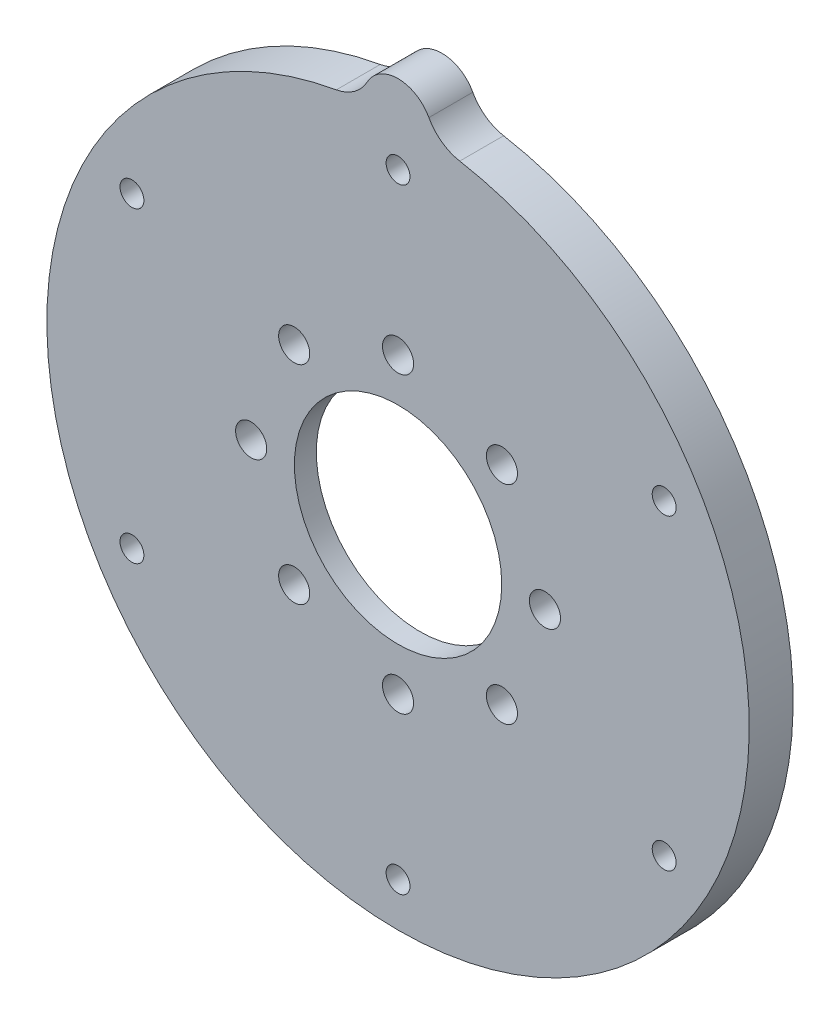
ISO-10303-21;
HEADER;
FILE_DESCRIPTION(('STEP AP214'),'2;1');
FILE_NAME('part.step','',(''),(''),'','','');
FILE_SCHEMA(('AUTOMOTIVE_DESIGN { 1 0 10303 214 1 1 1 1 }'));
ENDSEC;
DATA;
#1=APPLICATION_CONTEXT('core data for automotive mechanical design processes');
#2=APPLICATION_PROTOCOL_DEFINITION('international standard','automotive_design',2000,#1);
#3=PRODUCT_CONTEXT('',#1,'mechanical');
#4=PRODUCT('Part','Part','',(#3));
#5=PRODUCT_RELATED_PRODUCT_CATEGORY('part','',(#4));
#6=PRODUCT_DEFINITION_FORMATION('','',#4);
#7=PRODUCT_DEFINITION_CONTEXT('part definition',#1,'design');
#8=PRODUCT_DEFINITION('design','',#6,#7);
#9=PRODUCT_DEFINITION_SHAPE('','',#8);
#10=(LENGTH_UNIT() NAMED_UNIT(*) SI_UNIT(.MILLI.,.METRE.));
#11=(NAMED_UNIT(*) PLANE_ANGLE_UNIT() SI_UNIT($,.RADIAN.));
#12=(NAMED_UNIT(*) SI_UNIT($,.STERADIAN.) SOLID_ANGLE_UNIT());
#13=UNCERTAINTY_MEASURE_WITH_UNIT(LENGTH_MEASURE(1.E-05),#10,'distance_accuracy_value','');
#14=(GEOMETRIC_REPRESENTATION_CONTEXT(3) GLOBAL_UNCERTAINTY_ASSIGNED_CONTEXT((#13)) GLOBAL_UNIT_ASSIGNED_CONTEXT((#10,
#11,#12)) REPRESENTATION_CONTEXT('',''));
#15=CARTESIAN_POINT('',(0.,0.,0.));
#16=DIRECTION('',(0.,0.,1.));
#17=DIRECTION('',(1.,0.,0.));
#18=AXIS2_PLACEMENT_3D('',#15,#16,#17);
#19=CARTESIAN_POINT('',(0.,0.,6.35));
#20=DIRECTION('',(0.,0.,1.));
#21=DIRECTION('',(1.,0.,0.));
#22=AXIS2_PLACEMENT_3D('',#19,#20,#21);
#23=PLANE('',#22);
#24=CARTESIAN_POINT('',(-38.494829198218,22.2250000000004,6.35));
#25=DIRECTION('',(0.,0.,1.));
#26=DIRECTION('',(1.,0.,0.));
#27=AXIS2_PLACEMENT_3D('',#24,#25,#26);
#28=CIRCLE('',#27,1.72719999999998);
#29=CARTESIAN_POINT('',(-36.767629198218,22.2250000000004,6.35));
#30=VERTEX_POINT('',#29);
#31=EDGE_CURVE('E109',#30,#30,#28,.T.);
#32=ORIENTED_EDGE('',*,*,#31,.F.);
#33=EDGE_LOOP('',(#32));
#34=FACE_BOUND('',#33,.T.);
#35=CARTESIAN_POINT('',(-38.4948291982185,-22.2249999999996,6.35));
#36=DIRECTION('',(0.,0.,1.));
#37=DIRECTION('',(1.,0.,0.));
#38=AXIS2_PLACEMENT_3D('',#35,#36,#37);
#39=CIRCLE('',#38,1.72719999999999);
#40=CARTESIAN_POINT('',(-36.7676291982185,-22.2249999999996,6.35));
#41=VERTEX_POINT('',#40);
#42=EDGE_CURVE('E117',#41,#41,#39,.T.);
#43=ORIENTED_EDGE('',*,*,#42,.F.);
#44=EDGE_LOOP('',(#43));
#45=FACE_BOUND('',#44,.T.);
#46=CARTESIAN_POINT('',(0.,-44.45,6.35));
#47=DIRECTION('',(0.,0.,1.));
#48=DIRECTION('',(1.,0.,0.));
#49=AXIS2_PLACEMENT_3D('',#46,#47,#48);
#50=CIRCLE('',#49,1.72719999999999);
#51=CARTESIAN_POINT('',(1.72719999999999,-44.45,6.35));
#52=VERTEX_POINT('',#51);
#53=EDGE_CURVE('E123',#52,#52,#50,.T.);
#54=ORIENTED_EDGE('',*,*,#53,.F.);
#55=EDGE_LOOP('',(#54));
#56=FACE_BOUND('',#55,.T.);
#57=CARTESIAN_POINT('',(38.4948291982182,-22.2250000000002,6.35));
#58=DIRECTION('',(0.,0.,1.));
#59=DIRECTION('',(1.,0.,0.));
#60=AXIS2_PLACEMENT_3D('',#57,#58,#59);
#61=CIRCLE('',#60,1.72719999999998);
#62=CARTESIAN_POINT('',(40.2220291982182,-22.2250000000002,6.35));
#63=VERTEX_POINT('',#62);
#64=EDGE_CURVE('E129',#63,#63,#61,.T.);
#65=ORIENTED_EDGE('',*,*,#64,.F.);
#66=EDGE_LOOP('',(#65));
#67=FACE_BOUND('',#66,.T.);
#68=CARTESIAN_POINT('',(38.4948291982183,22.2249999999999,6.35));
#69=DIRECTION('',(0.,0.,1.));
#70=DIRECTION('',(1.,0.,0.));
#71=AXIS2_PLACEMENT_3D('',#68,#69,#70);
#72=CIRCLE('',#71,1.72719999999999);
#73=CARTESIAN_POINT('',(40.2220291982183,22.2249999999999,6.35));
#74=VERTEX_POINT('',#73);
#75=EDGE_CURVE('E135',#74,#74,#72,.T.);
#76=ORIENTED_EDGE('',*,*,#75,.F.);
#77=EDGE_LOOP('',(#76));
#78=FACE_BOUND('',#77,.T.);
#79=CARTESIAN_POINT('',(0.,44.45,6.35));
#80=DIRECTION('',(0.,0.,1.));
#81=DIRECTION('',(1.,0.,0.));
#82=AXIS2_PLACEMENT_3D('',#79,#80,#81);
#83=CIRCLE('',#82,1.72719999999999);
#84=CARTESIAN_POINT('',(1.72719999999999,44.45,6.35));
#85=VERTEX_POINT('',#84);
#86=EDGE_CURVE('E141',#85,#85,#83,.T.);
#87=ORIENTED_EDGE('',*,*,#86,.F.);
#88=EDGE_LOOP('',(#87));
#89=FACE_BOUND('',#88,.T.);
#90=CARTESIAN_POINT('',(-15.0260190422312,15.0260190422316,6.35));
#91=DIRECTION('',(0.,0.,1.));
#92=DIRECTION('',(1.,0.,0.));
#93=AXIS2_PLACEMENT_3D('',#90,#91,#92);
#94=CIRCLE('',#93,2.25);
#95=CARTESIAN_POINT('',(-12.7760190422312,15.0260190422316,6.35));
#96=VERTEX_POINT('',#95);
#97=EDGE_CURVE('E175',#96,#96,#94,.T.);
#98=ORIENTED_EDGE('',*,*,#97,.F.);
#99=EDGE_LOOP('',(#98));
#100=FACE_BOUND('',#99,.T.);
#101=CARTESIAN_POINT('',(-21.249999918,2.22582063411818E-13,6.35));
#102=DIRECTION('',(0.,0.,1.));
#103=DIRECTION('',(1.,0.,0.));
#104=AXIS2_PLACEMENT_3D('',#101,#102,#103);
#105=CIRCLE('',#104,2.25);
#106=CARTESIAN_POINT('',(-18.999999918,2.22582063411818E-13,6.35));
#107=VERTEX_POINT('',#106);
#108=EDGE_CURVE('E178',#107,#107,#105,.T.);
#109=ORIENTED_EDGE('',*,*,#108,.F.);
#110=EDGE_LOOP('',(#109));
#111=FACE_BOUND('',#110,.T.);
#112=CARTESIAN_POINT('',(-15.0260190422315,-15.0260190422312,6.35));
#113=DIRECTION('',(0.,0.,1.));
#114=DIRECTION('',(1.,0.,0.));
#115=AXIS2_PLACEMENT_3D('',#112,#113,#114);
#116=CIRCLE('',#115,2.25);
#117=CARTESIAN_POINT('',(-12.7760190422315,-15.0260190422312,6.35));
#118=VERTEX_POINT('',#117);
#119=EDGE_CURVE('E181',#118,#118,#116,.T.);
#120=ORIENTED_EDGE('',*,*,#119,.F.);
#121=EDGE_LOOP('',(#120));
#122=FACE_BOUND('',#121,.T.);
#123=CARTESIAN_POINT('',(0.,-21.249999918,6.35));
#124=DIRECTION('',(0.,0.,1.));
#125=DIRECTION('',(1.,0.,0.));
#126=AXIS2_PLACEMENT_3D('',#123,#124,#125);
#127=CIRCLE('',#126,2.25);
#128=CARTESIAN_POINT('',(2.25,-21.249999918,6.35));
#129=VERTEX_POINT('',#128);
#130=EDGE_CURVE('E184',#129,#129,#127,.T.);
#131=ORIENTED_EDGE('',*,*,#130,.F.);
#132=EDGE_LOOP('',(#131));
#133=FACE_BOUND('',#132,.T.);
#134=CARTESIAN_POINT('',(15.0260190422313,-15.0260190422315,6.35));
#135=DIRECTION('',(0.,0.,1.));
#136=DIRECTION('',(1.,0.,0.));
#137=AXIS2_PLACEMENT_3D('',#134,#135,#136);
#138=CIRCLE('',#137,2.25);
#139=CARTESIAN_POINT('',(17.2760190422313,-15.0260190422315,6.35));
#140=VERTEX_POINT('',#139);
#141=EDGE_CURVE('E187',#140,#140,#138,.T.);
#142=ORIENTED_EDGE('',*,*,#141,.F.);
#143=EDGE_LOOP('',(#142));
#144=FACE_BOUND('',#143,.T.);
#145=CARTESIAN_POINT('',(21.249999918,0.,6.35));
#146=DIRECTION('',(0.,0.,1.));
#147=DIRECTION('',(1.,0.,0.));
#148=AXIS2_PLACEMENT_3D('',#145,#146,#147);
#149=CIRCLE('',#148,2.25);
#150=CARTESIAN_POINT('',(23.499999918,0.,6.35));
#151=VERTEX_POINT('',#150);
#152=EDGE_CURVE('E190',#151,#151,#149,.T.);
#153=ORIENTED_EDGE('',*,*,#152,.F.);
#154=EDGE_LOOP('',(#153));
#155=FACE_BOUND('',#154,.T.);
#156=CARTESIAN_POINT('',(15.0260190422314,15.0260190422314,6.35));
#157=DIRECTION('',(0.,0.,1.));
#158=DIRECTION('',(1.,0.,0.));
#159=AXIS2_PLACEMENT_3D('',#156,#157,#158);
#160=CIRCLE('',#159,2.25);
#161=CARTESIAN_POINT('',(17.2760190422314,15.0260190422314,6.35));
#162=VERTEX_POINT('',#161);
#163=EDGE_CURVE('E193',#162,#162,#160,.T.);
#164=ORIENTED_EDGE('',*,*,#163,.F.);
#165=EDGE_LOOP('',(#164));
#166=FACE_BOUND('',#165,.T.);
#167=CARTESIAN_POINT('',(0.,21.249999918,6.35));
#168=DIRECTION('',(0.,0.,1.));
#169=DIRECTION('',(1.,0.,0.));
#170=AXIS2_PLACEMENT_3D('',#167,#168,#169);
#171=CIRCLE('',#170,2.25);
#172=CARTESIAN_POINT('',(2.25,21.249999918,6.35));
#173=VERTEX_POINT('',#172);
#174=EDGE_CURVE('E196',#173,#173,#171,.T.);
#175=ORIENTED_EDGE('',*,*,#174,.F.);
#176=EDGE_LOOP('',(#175));
#177=FACE_BOUND('',#176,.T.);
#178=CARTESIAN_POINT('',(0.,50.8,6.35));
#179=DIRECTION('',(0.,0.,1.));
#180=DIRECTION('',(1.,0.,0.));
#181=AXIS2_PLACEMENT_3D('',#178,#179,#180);
#182=CIRCLE('',#181,5.08000000000005);
#183=CARTESIAN_POINT('',(4.46268211441522,53.2271111111111,6.35));
#184=VERTEX_POINT('',#183);
#185=CARTESIAN_POINT('',(-4.46268211441522,53.2271111111111,6.35));
#186=VERTEX_POINT('',#185);
#187=EDGE_CURVE('E105',#184,#186,#182,.T.);
#188=ORIENTED_EDGE('',*,*,#187,.T.);
#189=CARTESIAN_POINT('',(-10.0410347574342,56.261,6.35));
#190=DIRECTION('',(0.,0.,1.));
#191=DIRECTION('',(1.,0.,0.));
#192=AXIS2_PLACEMENT_3D('',#189,#190,#191);
#193=CIRCLE('',#192,6.35);
#194=CARTESIAN_POINT('',(-8.92536422883038,50.0097777777778,6.35));
#195=VERTEX_POINT('',#194);
#196=EDGE_CURVE('E44',#186,#195,#193,.F.);
#197=ORIENTED_EDGE('',*,*,#196,.T.);
#198=CARTESIAN_POINT('',(0.,0.,6.35));
#199=DIRECTION('',(0.,0.,1.));
#200=DIRECTION('',(1.,0.,0.));
#201=AXIS2_PLACEMENT_3D('',#198,#199,#200);
#202=CIRCLE('',#201,50.8);
#203=CARTESIAN_POINT('',(8.92536422883039,50.0097777777778,6.35));
#204=VERTEX_POINT('',#203);
#205=EDGE_CURVE('E83',#195,#204,#202,.T.);
#206=ORIENTED_EDGE('',*,*,#205,.T.);
#207=CARTESIAN_POINT('',(10.0410347574342,56.261,6.35));
#208=DIRECTION('',(0.,0.,1.));
#209=DIRECTION('',(1.,0.,0.));
#210=AXIS2_PLACEMENT_3D('',#207,#208,#209);
#211=CIRCLE('',#210,6.35);
#212=EDGE_CURVE('E58',#204,#184,#211,.F.);
#213=ORIENTED_EDGE('',*,*,#212,.T.);
#214=EDGE_LOOP('',(#188,#197,#206,#213));
#215=FACE_BOUND('',#214,.T.);
#216=CARTESIAN_POINT('',(0.,0.,6.35));
#217=DIRECTION('',(0.,0.,1.));
#218=DIRECTION('',(1.,0.,0.));
#219=AXIS2_PLACEMENT_3D('',#216,#217,#218);
#220=CIRCLE('',#219,15.);
#221=CARTESIAN_POINT('',(15.,0.,6.35));
#222=VERTEX_POINT('',#221);
#223=EDGE_CURVE('E94',#222,#222,#220,.T.);
#224=ORIENTED_EDGE('',*,*,#223,.F.);
#225=EDGE_LOOP('',(#224));
#226=FACE_BOUND('',#225,.T.);
#227=ADVANCED_FACE('F36',(#34,#45,#56,#67,#78,#89,#100,#111,#122,#133,#144,#155,#166,#177,#215,
#226),#23,.T.);
#228=CARTESIAN_POINT('',(0.,0.,0.));
#229=DIRECTION('',(0.,0.,1.));
#230=DIRECTION('',(1.,0.,0.));
#231=AXIS2_PLACEMENT_3D('',#228,#229,#230);
#232=PLANE('',#231);
#233=CARTESIAN_POINT('',(-38.494829198218,22.2250000000004,0.));
#234=DIRECTION('',(0.,0.,1.));
#235=DIRECTION('',(1.,0.,0.));
#236=AXIS2_PLACEMENT_3D('',#233,#234,#235);
#237=CIRCLE('',#236,1.72719999999998);
#238=CARTESIAN_POINT('',(-36.767629198218,22.2250000000004,0.));
#239=VERTEX_POINT('',#238);
#240=EDGE_CURVE('E114',#239,#239,#237,.T.);
#241=ORIENTED_EDGE('',*,*,#240,.T.);
#242=EDGE_LOOP('',(#241));
#243=FACE_BOUND('',#242,.T.);
#244=CARTESIAN_POINT('',(-38.4948291982185,-22.2249999999996,0.));
#245=DIRECTION('',(0.,0.,1.));
#246=DIRECTION('',(1.,0.,0.));
#247=AXIS2_PLACEMENT_3D('',#244,#245,#246);
#248=CIRCLE('',#247,1.72719999999998);
#249=CARTESIAN_POINT('',(-36.7676291982185,-22.2249999999996,0.));
#250=VERTEX_POINT('',#249);
#251=EDGE_CURVE('E120',#250,#250,#248,.T.);
#252=ORIENTED_EDGE('',*,*,#251,.T.);
#253=EDGE_LOOP('',(#252));
#254=FACE_BOUND('',#253,.T.);
#255=CARTESIAN_POINT('',(0.,-44.45,0.));
#256=DIRECTION('',(0.,0.,1.));
#257=DIRECTION('',(1.,0.,0.));
#258=AXIS2_PLACEMENT_3D('',#255,#256,#257);
#259=CIRCLE('',#258,1.72719999999999);
#260=CARTESIAN_POINT('',(1.72719999999999,-44.45,0.));
#261=VERTEX_POINT('',#260);
#262=EDGE_CURVE('E126',#261,#261,#259,.T.);
#263=ORIENTED_EDGE('',*,*,#262,.T.);
#264=EDGE_LOOP('',(#263));
#265=FACE_BOUND('',#264,.T.);
#266=CARTESIAN_POINT('',(38.4948291982182,-22.2250000000002,0.));
#267=DIRECTION('',(0.,0.,1.));
#268=DIRECTION('',(1.,0.,0.));
#269=AXIS2_PLACEMENT_3D('',#266,#267,#268);
#270=CIRCLE('',#269,1.72719999999998);
#271=CARTESIAN_POINT('',(40.2220291982182,-22.2250000000002,0.));
#272=VERTEX_POINT('',#271);
#273=EDGE_CURVE('E132',#272,#272,#270,.T.);
#274=ORIENTED_EDGE('',*,*,#273,.T.);
#275=EDGE_LOOP('',(#274));
#276=FACE_BOUND('',#275,.T.);
#277=CARTESIAN_POINT('',(38.4948291982183,22.2249999999999,0.));
#278=DIRECTION('',(0.,0.,1.));
#279=DIRECTION('',(1.,0.,0.));
#280=AXIS2_PLACEMENT_3D('',#277,#278,#279);
#281=CIRCLE('',#280,1.72719999999998);
#282=CARTESIAN_POINT('',(40.2220291982183,22.2249999999999,0.));
#283=VERTEX_POINT('',#282);
#284=EDGE_CURVE('E138',#283,#283,#281,.T.);
#285=ORIENTED_EDGE('',*,*,#284,.T.);
#286=EDGE_LOOP('',(#285));
#287=FACE_BOUND('',#286,.T.);
#288=CARTESIAN_POINT('',(0.,44.45,0.));
#289=DIRECTION('',(0.,0.,1.));
#290=DIRECTION('',(1.,0.,0.));
#291=AXIS2_PLACEMENT_3D('',#288,#289,#290);
#292=CIRCLE('',#291,1.72719999999999);
#293=CARTESIAN_POINT('',(1.72719999999999,44.45,0.));
#294=VERTEX_POINT('',#293);
#295=EDGE_CURVE('E144',#294,#294,#292,.T.);
#296=ORIENTED_EDGE('',*,*,#295,.T.);
#297=EDGE_LOOP('',(#296));
#298=FACE_BOUND('',#297,.T.);
#299=CARTESIAN_POINT('',(0.,0.,0.));
#300=DIRECTION('',(0.,0.,1.));
#301=DIRECTION('',(1.,0.,0.));
#302=AXIS2_PLACEMENT_3D('',#299,#300,#301);
#303=CIRCLE('',#302,42.0374);
#304=CARTESIAN_POINT('',(42.0374,0.,0.));
#305=VERTEX_POINT('',#304);
#306=EDGE_CURVE('E86',#305,#305,#303,.T.);
#307=ORIENTED_EDGE('',*,*,#306,.T.);
#308=EDGE_LOOP('',(#307));
#309=FACE_BOUND('',#308,.T.);
#310=CARTESIAN_POINT('',(0.,0.,0.));
#311=DIRECTION('',(0.,0.,1.));
#312=DIRECTION('',(1.,0.,0.));
#313=AXIS2_PLACEMENT_3D('',#310,#311,#312);
#314=CIRCLE('',#313,50.8);
#315=CARTESIAN_POINT('',(-8.92536422883038,50.0097777777778,0.));
#316=VERTEX_POINT('',#315);
#317=CARTESIAN_POINT('',(8.92536422883039,50.0097777777778,0.));
#318=VERTEX_POINT('',#317);
#319=EDGE_CURVE('E81',#316,#318,#314,.T.);
#320=ORIENTED_EDGE('',*,*,#319,.F.);
#321=CARTESIAN_POINT('',(-10.0410347574342,56.261,0.));
#322=DIRECTION('',(0.,0.,1.));
#323=DIRECTION('',(1.,0.,0.));
#324=AXIS2_PLACEMENT_3D('',#321,#322,#323);
#325=CIRCLE('',#324,6.35);
#326=CARTESIAN_POINT('',(-4.46268211441522,53.2271111111111,0.));
#327=VERTEX_POINT('',#326);
#328=EDGE_CURVE('E12',#316,#327,#325,.T.);
#329=ORIENTED_EDGE('',*,*,#328,.T.);
#330=CARTESIAN_POINT('',(0.,50.8,0.));
#331=DIRECTION('',(0.,0.,1.));
#332=DIRECTION('',(1.,0.,0.));
#333=AXIS2_PLACEMENT_3D('',#330,#331,#332);
#334=CIRCLE('',#333,5.08000000000005);
#335=CARTESIAN_POINT('',(4.46268211441522,53.2271111111111,0.));
#336=VERTEX_POINT('',#335);
#337=EDGE_CURVE('E107',#327,#336,#334,.F.);
#338=ORIENTED_EDGE('',*,*,#337,.T.);
#339=CARTESIAN_POINT('',(10.0410347574342,56.261,0.));
#340=DIRECTION('',(0.,0.,1.));
#341=DIRECTION('',(1.,0.,0.));
#342=AXIS2_PLACEMENT_3D('',#339,#340,#341);
#343=CIRCLE('',#342,6.35);
#344=EDGE_CURVE('E93',#336,#318,#343,.T.);
#345=ORIENTED_EDGE('',*,*,#344,.T.);
#346=EDGE_LOOP('',(#320,#329,#338,#345));
#347=FACE_BOUND('',#346,.T.);
#348=ADVANCED_FACE('F89',(#243,#254,#265,#276,#287,#298,#309,#347),#232,.F.);
#349=CARTESIAN_POINT('',(0.,0.,6.35));
#350=DIRECTION('',(0.,0.,-1.));
#351=DIRECTION('',(-1.,0.,0.));
#352=AXIS2_PLACEMENT_3D('',#349,#350,#351);
#353=CYLINDRICAL_SURFACE('',#352,50.8);
#354=ORIENTED_EDGE('',*,*,#319,.T.);
#355=DIRECTION('',(0.,0.,-1.));
#356=VECTOR('',#355,1.);
#357=CARTESIAN_POINT('',(8.92536422883039,50.0097777777778,6.35));
#358=LINE('',#357,#356);
#359=EDGE_CURVE('E85',#318,#204,#358,.F.);
#360=ORIENTED_EDGE('',*,*,#359,.T.);
#361=ORIENTED_EDGE('',*,*,#205,.F.);
#362=DIRECTION('',(0.,0.,-1.));
#363=VECTOR('',#362,1.);
#364=CARTESIAN_POINT('',(-8.92536422883038,50.0097777777778,6.35));
#365=LINE('',#364,#363);
#366=EDGE_CURVE('E77',#195,#316,#365,.T.);
#367=ORIENTED_EDGE('',*,*,#366,.T.);
#368=EDGE_LOOP('',(#354,#360,#361,#367));
#369=FACE_BOUND('',#368,.T.);
#370=ADVANCED_FACE('F79',(#369),#353,.T.);
#371=CARTESIAN_POINT('',(0.,0.,6.35));
#372=DIRECTION('',(0.,0.,-1.));
#373=DIRECTION('',(-1.,0.,0.));
#374=AXIS2_PLACEMENT_3D('',#371,#372,#373);
#375=CYLINDRICAL_SURFACE('',#374,15.);
#376=CARTESIAN_POINT('',(0.,0.,3.175));
#377=DIRECTION('',(0.,0.,1.));
#378=DIRECTION('',(1.,0.,0.));
#379=AXIS2_PLACEMENT_3D('',#376,#377,#378);
#380=CIRCLE('',#379,15.);
#381=CARTESIAN_POINT('',(15.,0.,3.175));
#382=VERTEX_POINT('',#381);
#383=EDGE_CURVE('E172',#382,#382,#380,.T.);
#384=ORIENTED_EDGE('',*,*,#383,.F.);
#385=EDGE_LOOP('',(#384));
#386=FACE_BOUND('',#385,.T.);
#387=ORIENTED_EDGE('',*,*,#223,.T.);
#388=EDGE_LOOP('',(#387));
#389=FACE_BOUND('',#388,.T.);
#390=ADVANCED_FACE('F242',(#386,#389),#375,.F.);
#391=CARTESIAN_POINT('',(0.,21.249999918,6.35));
#392=DIRECTION('',(0.,0.,1.));
#393=DIRECTION('',(1.,0.,0.));
#394=AXIS2_PLACEMENT_3D('',#391,#392,#393);
#395=CYLINDRICAL_SURFACE('',#394,2.25);
#396=CARTESIAN_POINT('',(0.,21.249999918,3.175));
#397=DIRECTION('',(0.,0.,1.));
#398=DIRECTION('',(1.,0.,0.));
#399=AXIS2_PLACEMENT_3D('',#396,#397,#398);
#400=CIRCLE('',#399,2.25);
#401=CARTESIAN_POINT('',(2.25,21.249999918,3.175));
#402=VERTEX_POINT('',#401);
#403=EDGE_CURVE('E169',#402,#402,#400,.F.);
#404=ORIENTED_EDGE('',*,*,#403,.T.);
#405=EDGE_LOOP('',(#404));
#406=FACE_BOUND('',#405,.T.);
#407=ORIENTED_EDGE('',*,*,#174,.T.);
#408=EDGE_LOOP('',(#407));
#409=FACE_BOUND('',#408,.T.);
#410=ADVANCED_FACE('F238',(#406,#409),#395,.F.);
#411=CARTESIAN_POINT('',(15.0260190422314,15.0260190422314,6.35));
#412=DIRECTION('',(0.,0.,1.));
#413=DIRECTION('',(1.,0.,0.));
#414=AXIS2_PLACEMENT_3D('',#411,#412,#413);
#415=CYLINDRICAL_SURFACE('',#414,2.25);
#416=CARTESIAN_POINT('',(15.0260190422314,15.0260190422314,3.175));
#417=DIRECTION('',(0.,0.,1.));
#418=DIRECTION('',(1.,0.,0.));
#419=AXIS2_PLACEMENT_3D('',#416,#417,#418);
#420=CIRCLE('',#419,2.25);
#421=CARTESIAN_POINT('',(17.2760190422314,15.0260190422314,3.175));
#422=VERTEX_POINT('',#421);
#423=EDGE_CURVE('E166',#422,#422,#420,.F.);
#424=ORIENTED_EDGE('',*,*,#423,.T.);
#425=EDGE_LOOP('',(#424));
#426=FACE_BOUND('',#425,.T.);
#427=ORIENTED_EDGE('',*,*,#163,.T.);
#428=EDGE_LOOP('',(#427));
#429=FACE_BOUND('',#428,.T.);
#430=ADVANCED_FACE('F241',(#426,#429),#415,.F.);
#431=CARTESIAN_POINT('',(21.249999918,0.,6.35));
#432=DIRECTION('',(0.,0.,1.));
#433=DIRECTION('',(1.,0.,0.));
#434=AXIS2_PLACEMENT_3D('',#431,#432,#433);
#435=CYLINDRICAL_SURFACE('',#434,2.25);
#436=CARTESIAN_POINT('',(21.249999918,0.,3.175));
#437=DIRECTION('',(0.,0.,1.));
#438=DIRECTION('',(1.,0.,0.));
#439=AXIS2_PLACEMENT_3D('',#436,#437,#438);
#440=CIRCLE('',#439,2.25);
#441=CARTESIAN_POINT('',(23.499999918,0.,3.175));
#442=VERTEX_POINT('',#441);
#443=EDGE_CURVE('E163',#442,#442,#440,.F.);
#444=ORIENTED_EDGE('',*,*,#443,.T.);
#445=EDGE_LOOP('',(#444));
#446=FACE_BOUND('',#445,.T.);
#447=ORIENTED_EDGE('',*,*,#152,.T.);
#448=EDGE_LOOP('',(#447));
#449=FACE_BOUND('',#448,.T.);
#450=ADVANCED_FACE('F312',(#446,#449),#435,.F.);
#451=CARTESIAN_POINT('',(15.0260190422313,-15.0260190422315,6.35));
#452=DIRECTION('',(0.,0.,1.));
#453=DIRECTION('',(1.,0.,0.));
#454=AXIS2_PLACEMENT_3D('',#451,#452,#453);
#455=CYLINDRICAL_SURFACE('',#454,2.25);
#456=CARTESIAN_POINT('',(15.0260190422313,-15.0260190422315,3.175));
#457=DIRECTION('',(0.,0.,1.));
#458=DIRECTION('',(1.,0.,0.));
#459=AXIS2_PLACEMENT_3D('',#456,#457,#458);
#460=CIRCLE('',#459,2.25);
#461=CARTESIAN_POINT('',(17.2760190422313,-15.0260190422315,3.175));
#462=VERTEX_POINT('',#461);
#463=EDGE_CURVE('E160',#462,#462,#460,.F.);
#464=ORIENTED_EDGE('',*,*,#463,.T.);
#465=EDGE_LOOP('',(#464));
#466=FACE_BOUND('',#465,.T.);
#467=ORIENTED_EDGE('',*,*,#141,.T.);
#468=EDGE_LOOP('',(#467));
#469=FACE_BOUND('',#468,.T.);
#470=ADVANCED_FACE('F308',(#466,#469),#455,.F.);
#471=CARTESIAN_POINT('',(0.,-21.249999918,6.35));
#472=DIRECTION('',(0.,0.,1.));
#473=DIRECTION('',(1.,0.,0.));
#474=AXIS2_PLACEMENT_3D('',#471,#472,#473);
#475=CYLINDRICAL_SURFACE('',#474,2.25);
#476=CARTESIAN_POINT('',(0.,-21.249999918,3.175));
#477=DIRECTION('',(0.,0.,1.));
#478=DIRECTION('',(1.,0.,0.));
#479=AXIS2_PLACEMENT_3D('',#476,#477,#478);
#480=CIRCLE('',#479,2.25);
#481=CARTESIAN_POINT('',(2.25,-21.249999918,3.175));
#482=VERTEX_POINT('',#481);
#483=EDGE_CURVE('E157',#482,#482,#480,.F.);
#484=ORIENTED_EDGE('',*,*,#483,.T.);
#485=EDGE_LOOP('',(#484));
#486=FACE_BOUND('',#485,.T.);
#487=ORIENTED_EDGE('',*,*,#130,.T.);
#488=EDGE_LOOP('',(#487));
#489=FACE_BOUND('',#488,.T.);
#490=ADVANCED_FACE('F304',(#486,#489),#475,.F.);
#491=CARTESIAN_POINT('',(-15.0260190422315,-15.0260190422312,6.35));
#492=DIRECTION('',(0.,0.,1.));
#493=DIRECTION('',(1.,0.,0.));
#494=AXIS2_PLACEMENT_3D('',#491,#492,#493);
#495=CYLINDRICAL_SURFACE('',#494,2.25);
#496=CARTESIAN_POINT('',(-15.0260190422315,-15.0260190422312,3.175));
#497=DIRECTION('',(0.,0.,1.));
#498=DIRECTION('',(1.,0.,0.));
#499=AXIS2_PLACEMENT_3D('',#496,#497,#498);
#500=CIRCLE('',#499,2.25);
#501=CARTESIAN_POINT('',(-12.7760190422315,-15.0260190422312,3.175));
#502=VERTEX_POINT('',#501);
#503=EDGE_CURVE('E154',#502,#502,#500,.F.);
#504=ORIENTED_EDGE('',*,*,#503,.T.);
#505=EDGE_LOOP('',(#504));
#506=FACE_BOUND('',#505,.T.);
#507=ORIENTED_EDGE('',*,*,#119,.T.);
#508=EDGE_LOOP('',(#507));
#509=FACE_BOUND('',#508,.T.);
#510=ADVANCED_FACE('F300',(#506,#509),#495,.F.);
#511=CARTESIAN_POINT('',(-21.249999918,2.22582063411818E-13,6.35));
#512=DIRECTION('',(0.,0.,1.));
#513=DIRECTION('',(1.,0.,0.));
#514=AXIS2_PLACEMENT_3D('',#511,#512,#513);
#515=CYLINDRICAL_SURFACE('',#514,2.25);
#516=CARTESIAN_POINT('',(-21.249999918,2.22582063411818E-13,3.175));
#517=DIRECTION('',(0.,0.,1.));
#518=DIRECTION('',(1.,0.,0.));
#519=AXIS2_PLACEMENT_3D('',#516,#517,#518);
#520=CIRCLE('',#519,2.25);
#521=CARTESIAN_POINT('',(-18.999999918,2.22582063411818E-13,3.175));
#522=VERTEX_POINT('',#521);
#523=EDGE_CURVE('E151',#522,#522,#520,.F.);
#524=ORIENTED_EDGE('',*,*,#523,.T.);
#525=EDGE_LOOP('',(#524));
#526=FACE_BOUND('',#525,.T.);
#527=ORIENTED_EDGE('',*,*,#108,.T.);
#528=EDGE_LOOP('',(#527));
#529=FACE_BOUND('',#528,.T.);
#530=ADVANCED_FACE('F296',(#526,#529),#515,.F.);
#531=CARTESIAN_POINT('',(-15.0260190422312,15.0260190422316,6.35));
#532=DIRECTION('',(0.,0.,1.));
#533=DIRECTION('',(1.,0.,0.));
#534=AXIS2_PLACEMENT_3D('',#531,#532,#533);
#535=CYLINDRICAL_SURFACE('',#534,2.25);
#536=CARTESIAN_POINT('',(-15.0260190422312,15.0260190422316,3.175));
#537=DIRECTION('',(0.,0.,1.));
#538=DIRECTION('',(1.,0.,0.));
#539=AXIS2_PLACEMENT_3D('',#536,#537,#538);
#540=CIRCLE('',#539,2.25);
#541=CARTESIAN_POINT('',(-12.7760190422312,15.0260190422316,3.175));
#542=VERTEX_POINT('',#541);
#543=EDGE_CURVE('E150',#542,#542,#540,.F.);
#544=ORIENTED_EDGE('',*,*,#543,.T.);
#545=EDGE_LOOP('',(#544));
#546=FACE_BOUND('',#545,.T.);
#547=ORIENTED_EDGE('',*,*,#97,.T.);
#548=EDGE_LOOP('',(#547));
#549=FACE_BOUND('',#548,.T.);
#550=ADVANCED_FACE('F227',(#546,#549),#535,.F.);
#551=CARTESIAN_POINT('',(0.,0.,3.175));
#552=DIRECTION('',(0.,0.,1.));
#553=DIRECTION('',(1.,0.,0.));
#554=AXIS2_PLACEMENT_3D('',#551,#552,#553);
#555=PLANE('',#554);
#556=ORIENTED_EDGE('',*,*,#383,.T.);
#557=EDGE_LOOP('',(#556));
#558=FACE_BOUND('',#557,.T.);
#559=ORIENTED_EDGE('',*,*,#423,.F.);
#560=EDGE_LOOP('',(#559));
#561=FACE_BOUND('',#560,.T.);
#562=ORIENTED_EDGE('',*,*,#463,.F.);
#563=EDGE_LOOP('',(#562));
#564=FACE_BOUND('',#563,.T.);
#565=ORIENTED_EDGE('',*,*,#503,.F.);
#566=EDGE_LOOP('',(#565));
#567=FACE_BOUND('',#566,.T.);
#568=ORIENTED_EDGE('',*,*,#543,.F.);
#569=EDGE_LOOP('',(#568));
#570=FACE_BOUND('',#569,.T.);
#571=CARTESIAN_POINT('',(0.,0.,3.175));
#572=DIRECTION('',(0.,0.,1.));
#573=DIRECTION('',(1.,0.,0.));
#574=AXIS2_PLACEMENT_3D('',#571,#572,#573);
#575=CIRCLE('',#574,41.25);
#576=CARTESIAN_POINT('',(41.25,0.,3.175));
#577=VERTEX_POINT('',#576);
#578=EDGE_CURVE('E147',#577,#577,#575,.F.);
#579=ORIENTED_EDGE('',*,*,#578,.T.);
#580=EDGE_LOOP('',(#579));
#581=FACE_BOUND('',#580,.T.);
#582=ORIENTED_EDGE('',*,*,#523,.F.);
#583=EDGE_LOOP('',(#582));
#584=FACE_BOUND('',#583,.T.);
#585=ORIENTED_EDGE('',*,*,#483,.F.);
#586=EDGE_LOOP('',(#585));
#587=FACE_BOUND('',#586,.T.);
#588=ORIENTED_EDGE('',*,*,#443,.F.);
#589=EDGE_LOOP('',(#588));
#590=FACE_BOUND('',#589,.T.);
#591=ORIENTED_EDGE('',*,*,#403,.F.);
#592=EDGE_LOOP('',(#591));
#593=FACE_BOUND('',#592,.T.);
#594=ADVANCED_FACE('F221',(#558,#561,#564,#567,#570,#581,#584,#587,#590,#593),#555,.F.);
#595=CARTESIAN_POINT('',(0.,0.,123.02261889578));
#596=DIRECTION('',(0.,0.,-1.));
#597=DIRECTION('',(-1.,0.,0.));
#598=AXIS2_PLACEMENT_3D('',#595,#596,#597);
#599=CYLINDRICAL_SURFACE('',#598,41.25);
#600=CARTESIAN_POINT('',(0.,0.,0.787399999999994));
#601=DIRECTION('',(0.,0.,1.));
#602=DIRECTION('',(1.,0.,0.));
#603=AXIS2_PLACEMENT_3D('',#600,#601,#602);
#604=CIRCLE('',#603,41.25);
#605=CARTESIAN_POINT('',(41.25,0.,0.787399999999994));
#606=VERTEX_POINT('',#605);
#607=EDGE_CURVE('E201',#606,#606,#604,.F.);
#608=ORIENTED_EDGE('',*,*,#607,.T.);
#609=EDGE_LOOP('',(#608));
#610=FACE_BOUND('',#609,.T.);
#611=ORIENTED_EDGE('',*,*,#578,.F.);
#612=EDGE_LOOP('',(#611));
#613=FACE_BOUND('',#612,.T.);
#614=ADVANCED_FACE('F215',(#610,#613),#599,.F.);
#615=CARTESIAN_POINT('',(0.,0.,0.787399999999994));
#616=DIRECTION('',(0.,0.,-1.));
#617=DIRECTION('',(-1.,0.,0.));
#618=AXIS2_PLACEMENT_3D('',#615,#616,#617);
#619=CONICAL_SURFACE('',#618,41.25,0.785398163397444);
#620=ORIENTED_EDGE('',*,*,#306,.F.);
#621=EDGE_LOOP('',(#620));
#622=FACE_BOUND('',#621,.T.);
#623=ORIENTED_EDGE('',*,*,#607,.F.);
#624=EDGE_LOOP('',(#623));
#625=FACE_BOUND('',#624,.T.);
#626=ADVANCED_FACE('F211',(#622,#625),#619,.F.);
#627=CARTESIAN_POINT('',(0.,44.45,6.35));
#628=DIRECTION('',(0.,0.,1.));
#629=DIRECTION('',(1.,0.,0.));
#630=AXIS2_PLACEMENT_3D('',#627,#628,#629);
#631=CYLINDRICAL_SURFACE('',#630,1.72719999999999);
#632=ORIENTED_EDGE('',*,*,#295,.F.);
#633=EDGE_LOOP('',(#632));
#634=FACE_BOUND('',#633,.T.);
#635=ORIENTED_EDGE('',*,*,#86,.T.);
#636=EDGE_LOOP('',(#635));
#637=FACE_BOUND('',#636,.T.);
#638=ADVANCED_FACE('F214',(#634,#637),#631,.F.);
#639=CARTESIAN_POINT('',(38.4948291982183,22.2249999999999,6.35));
#640=DIRECTION('',(0.,0.,1.));
#641=DIRECTION('',(1.,0.,0.));
#642=AXIS2_PLACEMENT_3D('',#639,#640,#641);
#643=CYLINDRICAL_SURFACE('',#642,1.72719999999999);
#644=ORIENTED_EDGE('',*,*,#284,.F.);
#645=EDGE_LOOP('',(#644));
#646=FACE_BOUND('',#645,.T.);
#647=ORIENTED_EDGE('',*,*,#75,.T.);
#648=EDGE_LOOP('',(#647));
#649=FACE_BOUND('',#648,.T.);
#650=ADVANCED_FACE('F286',(#646,#649),#643,.F.);
#651=CARTESIAN_POINT('',(38.4948291982182,-22.2250000000002,6.35));
#652=DIRECTION('',(0.,0.,1.));
#653=DIRECTION('',(1.,0.,0.));
#654=AXIS2_PLACEMENT_3D('',#651,#652,#653);
#655=CYLINDRICAL_SURFACE('',#654,1.72719999999998);
#656=ORIENTED_EDGE('',*,*,#273,.F.);
#657=EDGE_LOOP('',(#656));
#658=FACE_BOUND('',#657,.T.);
#659=ORIENTED_EDGE('',*,*,#64,.T.);
#660=EDGE_LOOP('',(#659));
#661=FACE_BOUND('',#660,.T.);
#662=ADVANCED_FACE('F282',(#658,#661),#655,.F.);
#663=CARTESIAN_POINT('',(0.,-44.45,6.35));
#664=DIRECTION('',(0.,0.,1.));
#665=DIRECTION('',(1.,0.,0.));
#666=AXIS2_PLACEMENT_3D('',#663,#664,#665);
#667=CYLINDRICAL_SURFACE('',#666,1.72719999999999);
#668=ORIENTED_EDGE('',*,*,#262,.F.);
#669=EDGE_LOOP('',(#668));
#670=FACE_BOUND('',#669,.T.);
#671=ORIENTED_EDGE('',*,*,#53,.T.);
#672=EDGE_LOOP('',(#671));
#673=FACE_BOUND('',#672,.T.);
#674=ADVANCED_FACE('F278',(#670,#673),#667,.F.);
#675=CARTESIAN_POINT('',(-38.4948291982185,-22.2249999999996,6.35));
#676=DIRECTION('',(0.,0.,1.));
#677=DIRECTION('',(1.,0.,0.));
#678=AXIS2_PLACEMENT_3D('',#675,#676,#677);
#679=CYLINDRICAL_SURFACE('',#678,1.72719999999999);
#680=ORIENTED_EDGE('',*,*,#251,.F.);
#681=EDGE_LOOP('',(#680));
#682=FACE_BOUND('',#681,.T.);
#683=ORIENTED_EDGE('',*,*,#42,.T.);
#684=EDGE_LOOP('',(#683));
#685=FACE_BOUND('',#684,.T.);
#686=ADVANCED_FACE('F272',(#682,#685),#679,.F.);
#687=CARTESIAN_POINT('',(-38.494829198218,22.2250000000004,6.35));
#688=DIRECTION('',(0.,0.,1.));
#689=DIRECTION('',(1.,0.,0.));
#690=AXIS2_PLACEMENT_3D('',#687,#688,#689);
#691=CYLINDRICAL_SURFACE('',#690,1.72719999999998);
#692=ORIENTED_EDGE('',*,*,#240,.F.);
#693=EDGE_LOOP('',(#692));
#694=FACE_BOUND('',#693,.T.);
#695=ORIENTED_EDGE('',*,*,#31,.T.);
#696=EDGE_LOOP('',(#695));
#697=FACE_BOUND('',#696,.T.);
#698=ADVANCED_FACE('F267',(#694,#697),#691,.F.);
#699=CARTESIAN_POINT('',(0.,50.8,-11.4750667100459));
#700=DIRECTION('',(0.,0.,1.));
#701=DIRECTION('',(1.,0.,0.));
#702=AXIS2_PLACEMENT_3D('',#699,#700,#701);
#703=CYLINDRICAL_SURFACE('',#702,5.08000000000005);
#704=ORIENTED_EDGE('',*,*,#187,.F.);
#705=DIRECTION('',(0.,0.,1.));
#706=VECTOR('',#705,1.);
#707=CARTESIAN_POINT('',(4.46268211441522,53.2271111111111,-11.4750667100459));
#708=LINE('',#707,#706);
#709=EDGE_CURVE('E98',#184,#336,#708,.F.);
#710=ORIENTED_EDGE('',*,*,#709,.T.);
#711=ORIENTED_EDGE('',*,*,#337,.F.);
#712=DIRECTION('',(0.,0.,1.));
#713=VECTOR('',#712,1.);
#714=CARTESIAN_POINT('',(-4.46268211441522,53.2271111111111,-11.4750667100459));
#715=LINE('',#714,#713);
#716=EDGE_CURVE('E96',#327,#186,#715,.T.);
#717=ORIENTED_EDGE('',*,*,#716,.T.);
#718=EDGE_LOOP('',(#704,#710,#711,#717));
#719=FACE_BOUND('',#718,.T.);
#720=ADVANCED_FACE('F261',(#719),#703,.T.);
#721=CARTESIAN_POINT('',(10.0410347574342,56.261,-11.4750667100459));
#722=DIRECTION('',(0.,0.,-1.));
#723=DIRECTION('',(-1.,0.,0.));
#724=AXIS2_PLACEMENT_3D('',#721,#722,#723);
#725=CYLINDRICAL_SURFACE('',#724,6.35);
#726=ORIENTED_EDGE('',*,*,#344,.F.);
#727=ORIENTED_EDGE('',*,*,#709,.F.);
#728=ORIENTED_EDGE('',*,*,#212,.F.);
#729=ORIENTED_EDGE('',*,*,#359,.F.);
#730=EDGE_LOOP('',(#726,#727,#728,#729));
#731=FACE_BOUND('',#730,.T.);
#732=ADVANCED_FACE('F259',(#731),#725,.F.);
#733=CARTESIAN_POINT('',(-10.0410347574342,56.261,6.35));
#734=DIRECTION('',(0.,0.,-1.));
#735=DIRECTION('',(-1.,0.,0.));
#736=AXIS2_PLACEMENT_3D('',#733,#734,#735);
#737=CYLINDRICAL_SURFACE('',#736,6.35);
#738=ORIENTED_EDGE('',*,*,#328,.F.);
#739=ORIENTED_EDGE('',*,*,#366,.F.);
#740=ORIENTED_EDGE('',*,*,#196,.F.);
#741=ORIENTED_EDGE('',*,*,#716,.F.);
#742=EDGE_LOOP('',(#738,#739,#740,#741));
#743=FACE_BOUND('',#742,.T.);
#744=ADVANCED_FACE('F38',(#743),#737,.F.);
#745=CLOSED_SHELL('',(#227,#348,#370,#390,#410,#430,#450,#470,#490,#510,#530,#550,#594,#614,
#626,#638,#650,#662,#674,#686,#698,#720,#732,#744));
#746=MANIFOLD_SOLID_BREP('B2',#745);
#747=ADVANCED_BREP_SHAPE_REPRESENTATION('',(#18,#746),#14);
#748=SHAPE_DEFINITION_REPRESENTATION(#9,#747);
ENDSEC;
END-ISO-10303-21;
